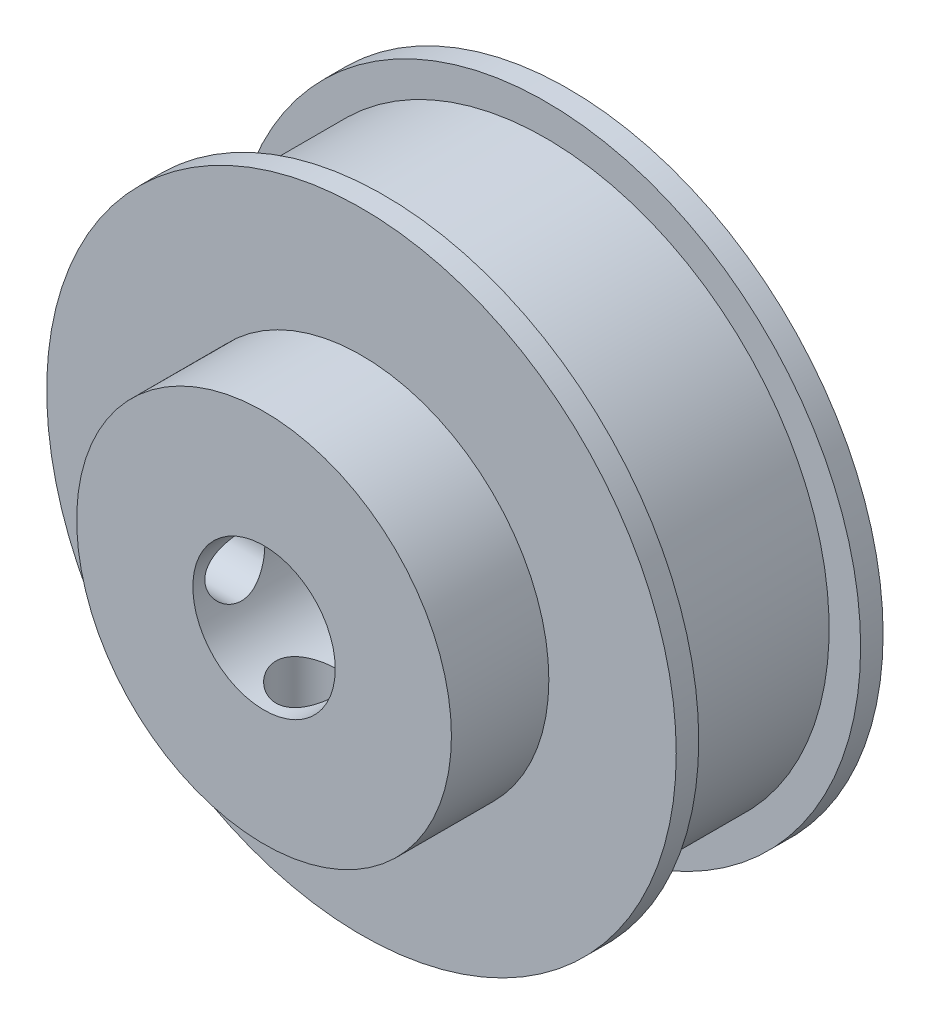
ISO-10303-21;
HEADER;
FILE_DESCRIPTION(('STEP AP214'),'2;1');
FILE_NAME('part.step','',(''),(''),'','','');
FILE_SCHEMA(('AUTOMOTIVE_DESIGN { 1 0 10303 214 1 1 1 1 }'));
ENDSEC;
DATA;
#1=APPLICATION_CONTEXT('core data for automotive mechanical design processes');
#2=APPLICATION_PROTOCOL_DEFINITION('international standard','automotive_design',2000,#1);
#3=PRODUCT_CONTEXT('',#1,'mechanical');
#4=PRODUCT('Part','Part','',(#3));
#5=PRODUCT_RELATED_PRODUCT_CATEGORY('part','',(#4));
#6=PRODUCT_DEFINITION_FORMATION('','',#4);
#7=PRODUCT_DEFINITION_CONTEXT('part definition',#1,'design');
#8=PRODUCT_DEFINITION('design','',#6,#7);
#9=PRODUCT_DEFINITION_SHAPE('','',#8);
#10=(LENGTH_UNIT() NAMED_UNIT(*) SI_UNIT(.MILLI.,.METRE.));
#11=(NAMED_UNIT(*) PLANE_ANGLE_UNIT() SI_UNIT($,.RADIAN.));
#12=(NAMED_UNIT(*) SI_UNIT($,.STERADIAN.) SOLID_ANGLE_UNIT());
#13=UNCERTAINTY_MEASURE_WITH_UNIT(LENGTH_MEASURE(1.E-05),#10,'distance_accuracy_value','');
#14=(GEOMETRIC_REPRESENTATION_CONTEXT(3) GLOBAL_UNCERTAINTY_ASSIGNED_CONTEXT((#13)) GLOBAL_UNIT_ASSIGNED_CONTEXT((#10,
#11,#12)) REPRESENTATION_CONTEXT('',''));
#15=CARTESIAN_POINT('',(0.,0.,0.));
#16=DIRECTION('',(0.,0.,1.));
#17=DIRECTION('',(1.,0.,0.));
#18=AXIS2_PLACEMENT_3D('',#15,#16,#17);
#19=CARTESIAN_POINT('',(0.,0.,13.8));
#20=DIRECTION('',(0.,0.,1.));
#21=DIRECTION('',(1.,0.,0.));
#22=AXIS2_PLACEMENT_3D('',#19,#20,#21);
#23=PLANE('',#22);
#24=CARTESIAN_POINT('',(0.,0.,13.8));
#25=DIRECTION('',(0.,0.,1.));
#26=DIRECTION('',(1.,0.,0.));
#27=AXIS2_PLACEMENT_3D('',#24,#25,#26);
#28=CIRCLE('',#27,21.);
#29=CARTESIAN_POINT('',(21.,0.,13.8));
#30=VERTEX_POINT('',#29);
#31=EDGE_CURVE('E144',#30,#30,#28,.T.);
#32=ORIENTED_EDGE('',*,*,#31,.T.);
#33=EDGE_LOOP('',(#32));
#34=FACE_BOUND('',#33,.T.);
#35=CARTESIAN_POINT('',(0.,0.,13.8));
#36=DIRECTION('',(0.,0.,1.));
#37=DIRECTION('',(1.,0.,0.));
#38=AXIS2_PLACEMENT_3D('',#35,#36,#37);
#39=CIRCLE('',#38,12.5);
#40=CARTESIAN_POINT('',(12.5,0.,13.8));
#41=VERTEX_POINT('',#40);
#42=EDGE_CURVE('E59',#41,#41,#39,.T.);
#43=ORIENTED_EDGE('',*,*,#42,.F.);
#44=EDGE_LOOP('',(#43));
#45=FACE_BOUND('',#44,.T.);
#46=ADVANCED_FACE('F31',(#34,#45),#23,.T.);
#47=CARTESIAN_POINT('',(0.,0.,1.5));
#48=DIRECTION('',(0.,0.,1.));
#49=DIRECTION('',(1.,0.,0.));
#50=AXIS2_PLACEMENT_3D('',#47,#48,#49);
#51=PLANE('',#50);
#52=CARTESIAN_POINT('',(0.,0.,1.5));
#53=DIRECTION('',(0.,0.,1.));
#54=DIRECTION('',(1.,0.,0.));
#55=AXIS2_PLACEMENT_3D('',#52,#53,#54);
#56=CIRCLE('',#55,21.);
#57=CARTESIAN_POINT('',(21.,0.,1.5));
#58=VERTEX_POINT('',#57);
#59=EDGE_CURVE('E10',#58,#58,#56,.T.);
#60=ORIENTED_EDGE('',*,*,#59,.T.);
#61=EDGE_LOOP('',(#60));
#62=FACE_BOUND('',#61,.T.);
#63=CARTESIAN_POINT('',(0.,0.,1.5));
#64=DIRECTION('',(0.,0.,1.));
#65=DIRECTION('',(1.,0.,0.));
#66=AXIS2_PLACEMENT_3D('',#63,#64,#65);
#67=CIRCLE('',#66,18.9);
#68=CARTESIAN_POINT('',(-18.9,0.,1.5));
#69=VERTEX_POINT('',#68);
#70=EDGE_CURVE('E51',#69,#69,#67,.T.);
#71=ORIENTED_EDGE('',*,*,#70,.F.);
#72=EDGE_LOOP('',(#71));
#73=FACE_BOUND('',#72,.T.);
#74=ADVANCED_FACE('F97',(#62,#73),#51,.T.);
#75=CARTESIAN_POINT('',(0.,0.,1.5));
#76=DIRECTION('',(0.,0.,-1.));
#77=DIRECTION('',(-1.,0.,0.));
#78=AXIS2_PLACEMENT_3D('',#75,#76,#77);
#79=CYLINDRICAL_SURFACE('',#78,21.);
#80=ORIENTED_EDGE('',*,*,#59,.F.);
#81=EDGE_LOOP('',(#80));
#82=FACE_BOUND('',#81,.T.);
#83=CARTESIAN_POINT('',(0.,0.,0.));
#84=DIRECTION('',(0.,0.,1.));
#85=DIRECTION('',(1.,0.,0.));
#86=AXIS2_PLACEMENT_3D('',#83,#84,#85);
#87=CIRCLE('',#86,21.);
#88=CARTESIAN_POINT('',(21.,0.,0.));
#89=VERTEX_POINT('',#88);
#90=EDGE_CURVE('E43',#89,#89,#87,.T.);
#91=ORIENTED_EDGE('',*,*,#90,.T.);
#92=EDGE_LOOP('',(#91));
#93=FACE_BOUND('',#92,.T.);
#94=ADVANCED_FACE('F33',(#82,#93),#79,.T.);
#95=CARTESIAN_POINT('',(0.,0.,0.));
#96=DIRECTION('',(0.,0.,1.));
#97=DIRECTION('',(1.,0.,0.));
#98=AXIS2_PLACEMENT_3D('',#95,#96,#97);
#99=PLANE('',#98);
#100=CARTESIAN_POINT('',(0.,0.,0.));
#101=DIRECTION('',(0.,0.,1.));
#102=DIRECTION('',(1.,0.,0.));
#103=AXIS2_PLACEMENT_3D('',#100,#101,#102);
#104=CIRCLE('',#103,4.75);
#105=CARTESIAN_POINT('',(4.75,0.,0.));
#106=VERTEX_POINT('',#105);
#107=EDGE_CURVE('E127',#106,#106,#104,.T.);
#108=ORIENTED_EDGE('',*,*,#107,.T.);
#109=EDGE_LOOP('',(#108));
#110=FACE_BOUND('',#109,.T.);
#111=ORIENTED_EDGE('',*,*,#90,.F.);
#112=EDGE_LOOP('',(#111));
#113=FACE_BOUND('',#112,.T.);
#114=ADVANCED_FACE('F116',(#110,#113),#99,.F.);
#115=CARTESIAN_POINT('',(0.,0.,12.3));
#116=DIRECTION('',(0.,0.,-1.));
#117=DIRECTION('',(-1.,0.,0.));
#118=AXIS2_PLACEMENT_3D('',#115,#116,#117);
#119=CYLINDRICAL_SURFACE('',#118,18.9);
#120=CARTESIAN_POINT('',(0.,0.,12.3));
#121=DIRECTION('',(0.,0.,1.));
#122=DIRECTION('',(1.,0.,0.));
#123=AXIS2_PLACEMENT_3D('',#120,#121,#122);
#124=CIRCLE('',#123,18.9);
#125=CARTESIAN_POINT('',(-18.9,0.,12.3));
#126=VERTEX_POINT('',#125);
#127=EDGE_CURVE('E48',#126,#126,#124,.T.);
#128=CARTESIAN_POINT('',(-18.9,0.,12.3));
#129=CARTESIAN_POINT('',(-18.9,0.,12.1875));
#130=CARTESIAN_POINT('',(-18.9,0.,12.075));
#131=CARTESIAN_POINT('',(-18.9,0.,11.85));
#132=CARTESIAN_POINT('',(-18.9,0.,11.7375));
#133=CARTESIAN_POINT('',(-18.9,0.,11.5125));
#134=CARTESIAN_POINT('',(-18.9,0.,11.4));
#135=CARTESIAN_POINT('',(-18.9,0.,11.175));
#136=CARTESIAN_POINT('',(-18.9,0.,11.0625));
#137=CARTESIAN_POINT('',(-18.9,0.,10.8375));
#138=CARTESIAN_POINT('',(-18.9,0.,10.725));
#139=CARTESIAN_POINT('',(-18.9,0.,10.5));
#140=CARTESIAN_POINT('',(-18.9,0.,10.3875));
#141=CARTESIAN_POINT('',(-18.9,0.,10.1625));
#142=CARTESIAN_POINT('',(-18.9,0.,10.05));
#143=CARTESIAN_POINT('',(-18.9,0.,9.825));
#144=CARTESIAN_POINT('',(-18.9,0.,9.7125));
#145=CARTESIAN_POINT('',(-18.9,0.,9.4875));
#146=CARTESIAN_POINT('',(-18.9,0.,9.375));
#147=CARTESIAN_POINT('',(-18.9,0.,9.15));
#148=CARTESIAN_POINT('',(-18.9,0.,9.0375));
#149=CARTESIAN_POINT('',(-18.9,0.,8.8125));
#150=CARTESIAN_POINT('',(-18.9,0.,8.7));
#151=CARTESIAN_POINT('',(-18.9,0.,8.475));
#152=CARTESIAN_POINT('',(-18.9,0.,8.3625));
#153=CARTESIAN_POINT('',(-18.9,0.,8.1375));
#154=CARTESIAN_POINT('',(-18.9,0.,8.025));
#155=CARTESIAN_POINT('',(-18.9,0.,7.8));
#156=CARTESIAN_POINT('',(-18.9,0.,7.6875));
#157=CARTESIAN_POINT('',(-18.9,0.,7.4625));
#158=CARTESIAN_POINT('',(-18.9,0.,7.35));
#159=CARTESIAN_POINT('',(-18.9,0.,7.125));
#160=CARTESIAN_POINT('',(-18.9,0.,7.0125));
#161=CARTESIAN_POINT('',(-18.9,0.,6.7875));
#162=CARTESIAN_POINT('',(-18.9,0.,6.675));
#163=CARTESIAN_POINT('',(-18.9,0.,6.45));
#164=CARTESIAN_POINT('',(-18.9,0.,6.3375));
#165=CARTESIAN_POINT('',(-18.9,0.,6.1125));
#166=CARTESIAN_POINT('',(-18.9,0.,6.));
#167=CARTESIAN_POINT('',(-18.9,0.,5.775));
#168=CARTESIAN_POINT('',(-18.9,0.,5.6625));
#169=CARTESIAN_POINT('',(-18.9,0.,5.4375));
#170=CARTESIAN_POINT('',(-18.9,0.,5.325));
#171=CARTESIAN_POINT('',(-18.9,0.,5.1));
#172=CARTESIAN_POINT('',(-18.9,0.,4.9875));
#173=CARTESIAN_POINT('',(-18.9,0.,4.7625));
#174=CARTESIAN_POINT('',(-18.9,0.,4.65));
#175=CARTESIAN_POINT('',(-18.9,0.,4.425));
#176=CARTESIAN_POINT('',(-18.9,0.,4.3125));
#177=CARTESIAN_POINT('',(-18.9,0.,4.0875));
#178=CARTESIAN_POINT('',(-18.9,0.,3.975));
#179=CARTESIAN_POINT('',(-18.9,0.,3.75));
#180=CARTESIAN_POINT('',(-18.9,0.,3.6375));
#181=CARTESIAN_POINT('',(-18.9,0.,3.4125));
#182=CARTESIAN_POINT('',(-18.9,0.,3.3));
#183=CARTESIAN_POINT('',(-18.9,0.,3.075));
#184=CARTESIAN_POINT('',(-18.9,0.,2.9625));
#185=CARTESIAN_POINT('',(-18.9,0.,2.7375));
#186=CARTESIAN_POINT('',(-18.9,0.,2.625));
#187=CARTESIAN_POINT('',(-18.9,0.,2.4));
#188=CARTESIAN_POINT('',(-18.9,0.,2.2875));
#189=CARTESIAN_POINT('',(-18.9,0.,2.0625));
#190=CARTESIAN_POINT('',(-18.9,0.,1.95));
#191=CARTESIAN_POINT('',(-18.9,0.,1.725));
#192=CARTESIAN_POINT('',(-18.9,0.,1.6125));
#193=CARTESIAN_POINT('',(-18.9,0.,1.5));
#194=B_SPLINE_CURVE_WITH_KNOTS('',3,(#128,#129,#130,#131,#132,#133,#134,#135,#136,#137,#138,
#139,#140,#141,#142,#143,#144,#145,#146,#147,#148,#149,#150,#151,#152,#153,#154,#155,#156,#157,
#158,#159,#160,#161,#162,#163,#164,#165,#166,#167,#168,#169,#170,#171,#172,#173,#174,#175,#176,
#177,#178,#179,#180,#181,#182,#183,#184,#185,#186,#187,#188,#189,#190,#191,#192,#193),
.UNSPECIFIED.,.F.,.F.,(4,2,2,2,2,2,2,2,2,2,2,2,2,2,2,2,2,2,2,2,2,2,2,2,2,2,2,2,2,2,2,2,4),(0.,
0.337500000000001,0.675,1.0125,1.35,1.6875,2.025,2.3625,2.7,3.0375,3.375,3.7125,4.05,4.3875,
4.725,5.0625,5.4,5.7375,6.075,6.4125,6.75,7.0875,7.425,7.7625,8.1,8.4375,8.775,9.1125,9.45,
9.7875,10.125,10.4625,10.8),.UNSPECIFIED.);
#195=EDGE_CURVE('BSEAM110',#126,#69,#194,.T.);
#196=ORIENTED_EDGE('',*,*,#127,.F.);
#197=ORIENTED_EDGE('',*,*,#70,.T.);
#198=ORIENTED_EDGE('',*,*,#195,.T.);
#199=ORIENTED_EDGE('',*,*,#195,.F.);
#200=EDGE_LOOP('',(#196,#198,#197,#199));
#201=FACE_BOUND('',#200,.T.);
#202=ADVANCED_FACE('F110',(#201),#119,.T.);
#203=CARTESIAN_POINT('',(0.,0.,12.3));
#204=DIRECTION('',(0.,0.,1.));
#205=DIRECTION('',(1.,0.,0.));
#206=AXIS2_PLACEMENT_3D('',#203,#204,#205);
#207=PLANE('',#206);
#208=CARTESIAN_POINT('',(0.,0.,12.3));
#209=DIRECTION('',(0.,0.,1.));
#210=DIRECTION('',(1.,0.,0.));
#211=AXIS2_PLACEMENT_3D('',#208,#209,#210);
#212=CIRCLE('',#211,21.);
#213=CARTESIAN_POINT('',(21.,0.,12.3));
#214=VERTEX_POINT('',#213);
#215=EDGE_CURVE('E142',#214,#214,#212,.T.);
#216=ORIENTED_EDGE('',*,*,#215,.F.);
#217=EDGE_LOOP('',(#216));
#218=FACE_BOUND('',#217,.T.);
#219=ORIENTED_EDGE('',*,*,#127,.T.);
#220=EDGE_LOOP('',(#219));
#221=FACE_BOUND('',#220,.T.);
#222=ADVANCED_FACE('F106',(#218,#221),#207,.F.);
#223=CARTESIAN_POINT('',(0.,0.,13.8));
#224=DIRECTION('',(0.,0.,-1.));
#225=DIRECTION('',(-1.,0.,0.));
#226=AXIS2_PLACEMENT_3D('',#223,#224,#225);
#227=CYLINDRICAL_SURFACE('',#226,21.);
#228=ORIENTED_EDGE('',*,*,#31,.F.);
#229=EDGE_LOOP('',(#228));
#230=FACE_BOUND('',#229,.T.);
#231=ORIENTED_EDGE('',*,*,#215,.T.);
#232=EDGE_LOOP('',(#231));
#233=FACE_BOUND('',#232,.T.);
#234=ADVANCED_FACE('F109',(#230,#233),#227,.T.);
#235=CARTESIAN_POINT('',(0.,0.,20.3));
#236=DIRECTION('',(0.,0.,-1.));
#237=DIRECTION('',(-1.,0.,0.));
#238=AXIS2_PLACEMENT_3D('',#235,#236,#237);
#239=CYLINDRICAL_SURFACE('',#238,12.5);
#240=CARTESIAN_POINT('',(-12.5,0.,19.5));
#241=CARTESIAN_POINT('',(-12.4999981342099,-0.111577020127934,19.4999954713698));
#242=CARTESIAN_POINT('',(-12.4984904676373,-0.223216523860334,19.4906313927068));
#243=CARTESIAN_POINT('',(-12.4926212341856,-0.443368779658238,19.453435552302));
#244=CARTESIAN_POINT('',(-12.4882569793104,-0.551878486135173,19.4255863960999));
#245=CARTESIAN_POINT('',(-12.4771644640129,-0.762553771126289,19.352279119554));
#246=CARTESIAN_POINT('',(-12.4704380773984,-0.864724302944008,19.3068349538792));
#247=CARTESIAN_POINT('',(-12.4553623980115,-1.05997584434547,19.1996632056022));
#248=CARTESIAN_POINT('',(-12.4470133072085,-1.15305798294893,19.1379376491164));
#249=CARTESIAN_POINT('',(-12.4295364290338,-1.32832749604674,18.9993743957376));
#250=CARTESIAN_POINT('',(-12.4204030044304,-1.41042286652597,18.9224210210548));
#251=CARTESIAN_POINT('',(-12.4024303990938,-1.56059410283783,18.755835532725));
#252=CARTESIAN_POINT('',(-12.393591236265,-1.62866911690709,18.6662026493313));
#253=CARTESIAN_POINT('',(-12.377153335782,-1.74923165413214,18.4761761138479));
#254=CARTESIAN_POINT('',(-12.369561883485,-1.80162899846097,18.3757245626384));
#255=CARTESIAN_POINT('',(-12.3565566594955,-1.88877230962607,18.1673043371312));
#256=CARTESIAN_POINT('',(-12.3511427525034,-1.92351937318009,18.0593361303625));
#257=CARTESIAN_POINT('',(-12.3431614474236,-1.97408758681328,17.8399196231352));
#258=CARTESIAN_POINT('',(-12.3405702530036,-1.990067044504,17.72850868905));
#259=CARTESIAN_POINT('',(-12.3384556715911,-2.00313711337577,17.5045590129146));
#260=CARTESIAN_POINT('',(-12.3389320844424,-2.00022895694193,17.3920203449255));
#261=CARTESIAN_POINT('',(-12.3428771480604,-1.97573547058135,17.1701349695011));
#262=CARTESIAN_POINT('',(-12.3463174079177,-1.95432734726415,17.060768122639));
#263=CARTESIAN_POINT('',(-12.3557581320174,-1.89371943513841,16.847198928902));
#264=CARTESIAN_POINT('',(-12.36175867776,-1.85451907995672,16.7429967465491));
#265=CARTESIAN_POINT('',(-12.375674818266,-1.75925788747207,16.5421807321441));
#266=CARTESIAN_POINT('',(-12.3835988093069,-1.7031228581751,16.4456027003146));
#267=CARTESIAN_POINT('',(-12.4004630811492,-1.57563852632363,16.2631697283147));
#268=CARTESIAN_POINT('',(-12.4094034376511,-1.50428809015537,16.1773155878768));
#269=CARTESIAN_POINT('',(-12.4274181245254,-1.34742984087892,16.0177411995627));
#270=CARTESIAN_POINT('',(-12.4364928200271,-1.26176985545599,15.9441704929312));
#271=CARTESIAN_POINT('',(-12.4536592708467,-1.07924037468053,15.812425261157));
#272=CARTESIAN_POINT('',(-12.4617510207175,-0.982370817216383,15.7542508213299));
#273=CARTESIAN_POINT('',(-12.4760500569944,-0.780035888309123,15.654938321886));
#274=CARTESIAN_POINT('',(-12.4822559575706,-0.674564267421534,15.6138127827311));
#275=CARTESIAN_POINT('',(-12.492072755936,-0.458089833939773,15.549900642074));
#276=CARTESIAN_POINT('',(-12.4956838535962,-0.347087448070732,15.5271126280629));
#277=CARTESIAN_POINT('',(-12.4998774645506,-0.123992055401972,15.500723529987));
#278=CARTESIAN_POINT('',(-12.5004923996757,-0.0119239336604407,15.4969170340423));
#279=CARTESIAN_POINT('',(-12.4987129750933,0.21124937151114,15.5080523816093));
#280=CARTESIAN_POINT('',(-12.4963187218055,0.322354588854285,15.5229935621113));
#281=CARTESIAN_POINT('',(-12.4888100015234,0.539818798235505,15.5710292981892));
#282=CARTESIAN_POINT('',(-12.4837106780256,0.646200674402081,15.6040228253046));
#283=CARTESIAN_POINT('',(-12.4713614614776,0.851922990585993,15.6871194685301));
#284=CARTESIAN_POINT('',(-12.4641114556453,0.95126306099119,15.7372234819381));
#285=CARTESIAN_POINT('',(-12.4481852151843,1.14097865112887,15.8535939993033));
#286=CARTESIAN_POINT('',(-12.4394977755831,1.2312740030957,15.9199896360231));
#287=CARTESIAN_POINT('',(-12.4216959541371,1.39951415639528,16.0668801543625));
#288=CARTESIAN_POINT('',(-12.4125815438834,1.47745813440283,16.1473759751283));
#289=CARTESIAN_POINT('',(-12.3948490273074,1.6195386653,16.321100388104));
#290=CARTESIAN_POINT('',(-12.3862364645378,1.6835368741472,16.4144427787868));
#291=CARTESIAN_POINT('',(-12.3705841030174,1.79494489210119,16.6106737811203));
#292=CARTESIAN_POINT('',(-12.3635442573346,1.84235519623835,16.7135621077771));
#293=CARTESIAN_POINT('',(-12.3518754120478,1.91903158354154,16.9255669592182));
#294=CARTESIAN_POINT('',(-12.3472370587722,1.94836814902516,17.0346574545979));
#295=CARTESIAN_POINT('',(-12.3408723222072,1.98828718554459,17.256297569992));
#296=CARTESIAN_POINT('',(-12.3391457074239,1.99887114748454,17.3688469142908));
#297=CARTESIAN_POINT('',(-12.3388093758569,2.00094546618394,17.5928294934366));
#298=CARTESIAN_POINT('',(-12.3401641282165,1.99265347821446,17.7042607195398));
#299=CARTESIAN_POINT('',(-12.3457602825821,1.95768017972975,17.9241213226272));
#300=CARTESIAN_POINT('',(-12.3500016772787,1.93099891577862,18.0325507072119));
#301=CARTESIAN_POINT('',(-12.3608801586201,1.86008521855063,18.2432553500165));
#302=CARTESIAN_POINT('',(-12.3675148843103,1.81587007770133,18.3455365576413));
#303=CARTESIAN_POINT('',(-12.3824349767408,1.71116577284244,18.5412644676731));
#304=CARTESIAN_POINT('',(-12.3907204147391,1.65067590624507,18.6347107884382));
#305=CARTESIAN_POINT('',(-12.4081216807701,1.51435663599677,18.8112185808365));
#306=CARTESIAN_POINT('',(-12.417245602178,1.43836664580959,18.8941552479004));
#307=CARTESIAN_POINT('',(-12.4352300129975,1.27354334357952,19.0461753813975));
#308=CARTESIAN_POINT('',(-12.44409044097,1.18470706402004,19.1152556381487));
#309=CARTESIAN_POINT('',(-12.4606140562915,0.99604834657733,19.2379974661718));
#310=CARTESIAN_POINT('',(-12.4682693265296,0.896160049794844,19.2915588738874));
#311=CARTESIAN_POINT('',(-12.4814428750468,0.688725166968653,19.3810612928991));
#312=CARTESIAN_POINT('',(-12.4869633156233,0.581186461209752,19.417020143104));
#313=CARTESIAN_POINT('',(-12.4940175589639,0.394335518838039,19.4623457387355));
#314=CARTESIAN_POINT('',(-12.4962491778317,0.316163477498691,19.4764439027928));
#315=CARTESIAN_POINT('',(-12.4992410506714,0.158671480151703,19.4952725728636));
#316=CARTESIAN_POINT('',(-12.5000013269159,0.0793515415388271,19.5000032206792));
#317=CARTESIAN_POINT('',(-12.5,0.,19.5));
#318=B_SPLINE_CURVE_WITH_KNOTS('',3,(#240,#241,#242,#243,#244,#245,#246,#247,#248,#249,#250,
#251,#252,#253,#254,#255,#256,#257,#258,#259,#260,#261,#262,#263,#264,#265,#266,#267,#268,#269,
#270,#271,#272,#273,#274,#275,#276,#277,#278,#279,#280,#281,#282,#283,#284,#285,#286,#287,#288,
#289,#290,#291,#292,#293,#294,#295,#296,#297,#298,#299,#300,#301,#302,#303,#304,#305,#306,#307,
#308,#309,#310,#311,#312,#313,#314,#315,#316,#317),.UNSPECIFIED.,.T.,.F.,(4,2,2,2,2,2,2,2,2,2,2,
2,2,2,2,2,2,2,2,2,2,2,2,2,2,2,2,2,2,2,2,2,2,2,2,2,2,2,4),(0.,0.334441046622945,
0.669197249319467,1.00368849765686,1.33813814029104,1.67523334608234,2.0123490250128,
2.35136809625946,2.69036609964137,3.0264835846965,3.36257913887026,3.695490558905,
4.02841257712192,4.36281487068318,4.69724208737484,5.03548313337389,5.37372605363721,
5.71221693636019,6.05068174320194,6.38547572150114,6.72025786018134,7.05318530227048,
7.38613020622256,7.72180459283845,8.0575013456327,8.39639027086604,8.73526908182521,
9.07281785760314,9.41033979575026,9.74398956846141,10.0776384963298,10.4109591848676,
10.7442942653298,11.0812763085405,11.4183363199473,11.7575256865024,12.0963705940352,
12.3342225666998,12.5720709388195),.UNSPECIFIED.);
#319=CARTESIAN_POINT('',(-12.5,0.,19.5));
#320=VERTEX_POINT('',#319);
#321=EDGE_CURVE('E60',#320,#320,#318,.T.);
#322=ORIENTED_EDGE('',*,*,#321,.T.);
#323=EDGE_LOOP('',(#322));
#324=FACE_BOUND('',#323,.T.);
#325=CARTESIAN_POINT('',(0.,-12.5,19.5));
#326=CARTESIAN_POINT('',(0.111577020127936,-12.4999981342099,19.4999954713698));
#327=CARTESIAN_POINT('',(0.223216523860337,-12.4984904676373,19.4906313927068));
#328=CARTESIAN_POINT('',(0.443368779658241,-12.4926212341856,19.453435552302));
#329=CARTESIAN_POINT('',(0.551878486135176,-12.4882569793104,19.4255863960999));
#330=CARTESIAN_POINT('',(0.762553771126291,-12.4771644640129,19.352279119554));
#331=CARTESIAN_POINT('',(0.86472430294401,-12.4704380773984,19.3068349538792));
#332=CARTESIAN_POINT('',(1.05997584434547,-12.4553623980115,19.1996632056022));
#333=CARTESIAN_POINT('',(1.15305798294894,-12.4470133072085,19.1379376491164));
#334=CARTESIAN_POINT('',(1.32832749604675,-12.4295364290338,18.9993743957376));
#335=CARTESIAN_POINT('',(1.41042286652597,-12.4204030044304,18.9224210210548));
#336=CARTESIAN_POINT('',(1.56059410283783,-12.4024303990938,18.755835532725));
#337=CARTESIAN_POINT('',(1.62866911690709,-12.393591236265,18.6662026493313));
#338=CARTESIAN_POINT('',(1.74923165413214,-12.377153335782,18.4761761138479));
#339=CARTESIAN_POINT('',(1.80162899846097,-12.369561883485,18.3757245626384));
#340=CARTESIAN_POINT('',(1.88877230962607,-12.3565566594955,18.1673043371312));
#341=CARTESIAN_POINT('',(1.92351937318009,-12.3511427525034,18.0593361303625));
#342=CARTESIAN_POINT('',(1.97408758681328,-12.3431614474236,17.8399196231352));
#343=CARTESIAN_POINT('',(1.99006704450401,-12.3405702530036,17.72850868905));
#344=CARTESIAN_POINT('',(2.00313711337577,-12.3384556715911,17.5045590129146));
#345=CARTESIAN_POINT('',(2.00022895694193,-12.3389320844424,17.3920203449255));
#346=CARTESIAN_POINT('',(1.97573547058135,-12.3428771480604,17.1701349695011));
#347=CARTESIAN_POINT('',(1.95432734726415,-12.3463174079177,17.060768122639));
#348=CARTESIAN_POINT('',(1.89371943513841,-12.3557581320174,16.847198928902));
#349=CARTESIAN_POINT('',(1.85451907995672,-12.36175867776,16.7429967465491));
#350=CARTESIAN_POINT('',(1.75925788747207,-12.375674818266,16.5421807321441));
#351=CARTESIAN_POINT('',(1.7031228581751,-12.3835988093069,16.4456027003146));
#352=CARTESIAN_POINT('',(1.57563852632363,-12.4004630811492,16.2631697283147));
#353=CARTESIAN_POINT('',(1.50428809015537,-12.4094034376511,16.1773155878768));
#354=CARTESIAN_POINT('',(1.34742984087892,-12.4274181245254,16.0177411995627));
#355=CARTESIAN_POINT('',(1.26176985545599,-12.4364928200271,15.9441704929312));
#356=CARTESIAN_POINT('',(1.07924037468053,-12.4536592708467,15.812425261157));
#357=CARTESIAN_POINT('',(0.982370817216381,-12.4617510207175,15.7542508213299));
#358=CARTESIAN_POINT('',(0.78003588830912,-12.4760500569944,15.654938321886));
#359=CARTESIAN_POINT('',(0.674564267421531,-12.4822559575706,15.6138127827311));
#360=CARTESIAN_POINT('',(0.45808983393977,-12.492072755936,15.549900642074));
#361=CARTESIAN_POINT('',(0.34708744807073,-12.4956838535962,15.5271126280629));
#362=CARTESIAN_POINT('',(0.123992055401969,-12.4998774645506,15.500723529987));
#363=CARTESIAN_POINT('',(0.0119239336604373,-12.5004923996757,15.4969170340423));
#364=CARTESIAN_POINT('',(-0.211249371511144,-12.4987129750933,15.5080523816093));
#365=CARTESIAN_POINT('',(-0.322354588854289,-12.4963187218055,15.5229935621113));
#366=CARTESIAN_POINT('',(-0.539818798235508,-12.4888100015234,15.5710292981892));
#367=CARTESIAN_POINT('',(-0.646200674402082,-12.4837106780256,15.6040228253046));
#368=CARTESIAN_POINT('',(-0.851922990585995,-12.4713614614776,15.6871194685301));
#369=CARTESIAN_POINT('',(-0.951263060991192,-12.4641114556453,15.7372234819381));
#370=CARTESIAN_POINT('',(-1.14097865112887,-12.4481852151843,15.8535939993033));
#371=CARTESIAN_POINT('',(-1.2312740030957,-12.4394977755831,15.9199896360231));
#372=CARTESIAN_POINT('',(-1.39951415639529,-12.4216959541371,16.0668801543625));
#373=CARTESIAN_POINT('',(-1.47745813440283,-12.4125815438834,16.1473759751283));
#374=CARTESIAN_POINT('',(-1.61953866530001,-12.3948490273074,16.321100388104));
#375=CARTESIAN_POINT('',(-1.6835368741472,-12.3862364645378,16.4144427787868));
#376=CARTESIAN_POINT('',(-1.7949448921012,-12.3705841030174,16.6106737811203));
#377=CARTESIAN_POINT('',(-1.84235519623835,-12.3635442573346,16.7135621077771));
#378=CARTESIAN_POINT('',(-1.91903158354154,-12.3518754120478,16.9255669592182));
#379=CARTESIAN_POINT('',(-1.94836814902516,-12.3472370587722,17.0346574545979));
#380=CARTESIAN_POINT('',(-1.98828718554459,-12.3408723222072,17.256297569992));
#381=CARTESIAN_POINT('',(-1.99887114748454,-12.3391457074239,17.3688469142908));
#382=CARTESIAN_POINT('',(-2.00094546618394,-12.3388093758569,17.5928294934366));
#383=CARTESIAN_POINT('',(-1.99265347821446,-12.3401641282165,17.7042607195398));
#384=CARTESIAN_POINT('',(-1.95768017972975,-12.3457602825821,17.9241213226272));
#385=CARTESIAN_POINT('',(-1.93099891577862,-12.3500016772787,18.0325507072119));
#386=CARTESIAN_POINT('',(-1.86008521855063,-12.3608801586201,18.2432553500165));
#387=CARTESIAN_POINT('',(-1.81587007770133,-12.3675148843103,18.3455365576413));
#388=CARTESIAN_POINT('',(-1.71116577284243,-12.3824349767408,18.5412644676731));
#389=CARTESIAN_POINT('',(-1.65067590624507,-12.3907204147391,18.6347107884382));
#390=CARTESIAN_POINT('',(-1.51435663599676,-12.4081216807701,18.8112185808365));
#391=CARTESIAN_POINT('',(-1.43836664580959,-12.417245602178,18.8941552479004));
#392=CARTESIAN_POINT('',(-1.27354334357952,-12.4352300129975,19.0461753813975));
#393=CARTESIAN_POINT('',(-1.18470706402004,-12.44409044097,19.1152556381487));
#394=CARTESIAN_POINT('',(-0.996048346577327,-12.4606140562915,19.2379974661718));
#395=CARTESIAN_POINT('',(-0.896160049794841,-12.4682693265296,19.2915588738874));
#396=CARTESIAN_POINT('',(-0.68872516696865,-12.4814428750468,19.3810612928991));
#397=CARTESIAN_POINT('',(-0.581186461209748,-12.4869633156233,19.417020143104));
#398=CARTESIAN_POINT('',(-0.394335518838035,-12.4940175589639,19.4623457387355));
#399=CARTESIAN_POINT('',(-0.316163477498688,-12.4962491778317,19.4764439027928));
#400=CARTESIAN_POINT('',(-0.158671480151701,-12.4992410506714,19.4952725728636));
#401=CARTESIAN_POINT('',(-0.079351541538825,-12.5000013269159,19.5000032206792));
#402=CARTESIAN_POINT('',(0.,-12.5,19.5));
#403=B_SPLINE_CURVE_WITH_KNOTS('',3,(#325,#326,#327,#328,#329,#330,#331,#332,#333,#334,#335,
#336,#337,#338,#339,#340,#341,#342,#343,#344,#345,#346,#347,#348,#349,#350,#351,#352,#353,#354,
#355,#356,#357,#358,#359,#360,#361,#362,#363,#364,#365,#366,#367,#368,#369,#370,#371,#372,#373,
#374,#375,#376,#377,#378,#379,#380,#381,#382,#383,#384,#385,#386,#387,#388,#389,#390,#391,#392,
#393,#394,#395,#396,#397,#398,#399,#400,#401,#402),.UNSPECIFIED.,.T.,.F.,(4,2,2,2,2,2,2,2,2,2,2,
2,2,2,2,2,2,2,2,2,2,2,2,2,2,2,2,2,2,2,2,2,2,2,2,2,2,2,4),(0.,0.334441046622945,
0.669197249319468,1.00368849765686,1.33813814029104,1.67523334608234,2.0123490250128,
2.35136809625945,2.69036609964138,3.0264835846965,3.36257913887026,3.695490558905,
4.02841257712193,4.36281487068318,4.69724208737484,5.0354831333739,5.37372605363722,
5.71221693636019,6.05068174320195,6.38547572150115,6.72025786018135,7.05318530227048,
7.38613020622257,7.72180459283845,8.05750134563271,8.39639027086604,8.73526908182521,
9.07281785760315,9.41033979575028,9.74398956846142,10.0776384963298,10.4109591848676,
10.7442942653299,11.0812763085405,11.4183363199474,11.7575256865024,12.0963705940352,
12.3342225666999,12.5720709388195),.UNSPECIFIED.);
#404=CARTESIAN_POINT('',(0.,-12.5,19.5));
#405=VERTEX_POINT('',#404);
#406=EDGE_CURVE('E53',#405,#405,#403,.T.);
#407=ORIENTED_EDGE('',*,*,#406,.T.);
#408=EDGE_LOOP('',(#407));
#409=FACE_BOUND('',#408,.T.);
#410=CARTESIAN_POINT('',(0.,0.,20.3));
#411=DIRECTION('',(0.,0.,1.));
#412=DIRECTION('',(1.,0.,0.));
#413=AXIS2_PLACEMENT_3D('',#410,#411,#412);
#414=CIRCLE('',#413,12.5);
#415=CARTESIAN_POINT('',(12.5,0.,20.3));
#416=VERTEX_POINT('',#415);
#417=EDGE_CURVE('E140',#416,#416,#414,.T.);
#418=ORIENTED_EDGE('',*,*,#417,.F.);
#419=EDGE_LOOP('',(#418));
#420=FACE_BOUND('',#419,.T.);
#421=ORIENTED_EDGE('',*,*,#42,.T.);
#422=EDGE_LOOP('',(#421));
#423=FACE_BOUND('',#422,.T.);
#424=ADVANCED_FACE('F61',(#324,#409,#420,#423),#239,.T.);
#425=CARTESIAN_POINT('',(0.,0.,20.3));
#426=DIRECTION('',(0.,0.,1.));
#427=DIRECTION('',(1.,0.,0.));
#428=AXIS2_PLACEMENT_3D('',#425,#426,#427);
#429=PLANE('',#428);
#430=CARTESIAN_POINT('',(0.,0.,20.3));
#431=DIRECTION('',(0.,0.,1.));
#432=DIRECTION('',(1.,0.,0.));
#433=AXIS2_PLACEMENT_3D('',#430,#431,#432);
#434=CIRCLE('',#433,4.75);
#435=CARTESIAN_POINT('',(4.75,0.,20.3));
#436=VERTEX_POINT('',#435);
#437=EDGE_CURVE('E80',#436,#436,#434,.T.);
#438=ORIENTED_EDGE('',*,*,#437,.F.);
#439=EDGE_LOOP('',(#438));
#440=FACE_BOUND('',#439,.T.);
#441=ORIENTED_EDGE('',*,*,#417,.T.);
#442=EDGE_LOOP('',(#441));
#443=FACE_BOUND('',#442,.T.);
#444=ADVANCED_FACE('F69',(#440,#443),#429,.T.);
#445=CARTESIAN_POINT('',(0.,-21.,17.5));
#446=DIRECTION('',(0.,1.,0.));
#447=DIRECTION('',(0.,0.,1.));
#448=AXIS2_PLACEMENT_3D('',#445,#446,#447);
#449=CYLINDRICAL_SURFACE('',#448,2.);
#450=CARTESIAN_POINT('',(0.,-4.75,19.5));
#451=CARTESIAN_POINT('',(0.10703646236846,-4.74999105230107,19.49998814533));
#452=CARTESIAN_POINT('',(0.214236246167392,-4.7463402994097,19.4913565895315));
#453=CARTESIAN_POINT('',(0.425593131869903,-4.73208882609393,19.4571391510735));
#454=CARTESIAN_POINT('',(0.529741661649222,-4.7214701827862,19.4315095440171));
#455=CARTESIAN_POINT('',(0.731590406184855,-4.69442284735135,19.3644147945537));
#456=CARTESIAN_POINT('',(0.829311330167876,-4.67801402078023,19.3230037583225));
#457=CARTESIAN_POINT('',(1.01632284675021,-4.64097919078582,19.2257473571231));
#458=CARTESIAN_POINT('',(1.10561588355067,-4.62035441557184,19.1699061947558));
#459=CARTESIAN_POINT('',(1.27793883653739,-4.57576887526126,19.0423656992795));
#460=CARTESIAN_POINT('',(1.36048223127562,-4.55169736788395,18.9700480867997));
#461=CARTESIAN_POINT('',(1.51268912853783,-4.50340541179333,18.81291550367));
#462=CARTESIAN_POINT('',(1.58234571599153,-4.4791848902796,18.7280938669603));
#463=CARTESIAN_POINT('',(1.71027969557346,-4.43196710928289,18.543171836268));
#464=CARTESIAN_POINT('',(1.76780496391063,-4.40909335958272,18.4425162424037));
#465=CARTESIAN_POINT('',(1.86489069620242,-4.36892020968374,18.2318559560335));
#466=CARTESIAN_POINT('',(1.90446060785823,-4.35161787932547,18.1218562164644));
#467=CARTESIAN_POINT('',(1.96249248078311,-4.32574780180008,17.9012307350763));
#468=CARTESIAN_POINT('',(1.98189190257055,-4.31679434717452,17.7908985723402));
#469=CARTESIAN_POINT('',(2.00195562895775,-4.30752932662971,17.5682098561765));
#470=CARTESIAN_POINT('',(2.00263058226539,-4.30721284881606,17.4558544897403));
#471=CARTESIAN_POINT('',(1.98593120072108,-4.31493181644961,17.2417391267059));
#472=CARTESIAN_POINT('',(1.96997131078922,-4.32231278335098,17.1398404376461));
#473=CARTESIAN_POINT('',(1.92283162811083,-4.34348696653289,16.9403306214134));
#474=CARTESIAN_POINT('',(1.89164884741754,-4.35728144163054,16.8427203400698));
#475=CARTESIAN_POINT('',(1.81433790634179,-4.39004171904363,16.652066315206));
#476=CARTESIAN_POINT('',(1.76790298398402,-4.40911227810592,16.5591657763444));
#477=CARTESIAN_POINT('',(1.66162325591989,-4.45025281005121,16.3821089440219));
#478=CARTESIAN_POINT('',(1.60177309979156,-4.47232397828682,16.2979561590997));
#479=CARTESIAN_POINT('',(1.46428805277278,-4.51930009875198,16.1331243123109));
#480=CARTESIAN_POINT('',(1.38556278942612,-4.54428505688557,16.0533749108059));
#481=CARTESIAN_POINT('',(1.21561328405726,-4.59266646060081,15.9078945918117));
#482=CARTESIAN_POINT('',(1.12438599890452,-4.61606251734623,15.8421670973995));
#483=CARTESIAN_POINT('',(0.929145948219356,-4.65933566537717,15.7251934799301));
#484=CARTESIAN_POINT('',(0.824878687890048,-4.67911472030857,15.6743331679441));
#485=CARTESIAN_POINT('',(0.608222262411324,-4.7121696275971,15.5912027892268));
#486=CARTESIAN_POINT('',(0.495837723966101,-4.72544915152312,15.5589222250242));
#487=CARTESIAN_POINT('',(0.273899430083203,-4.7433183819797,15.5158312001314));
#488=CARTESIAN_POINT('',(0.16462836290715,-4.74841197266554,15.5037735937097));
#489=CARTESIAN_POINT('',(-0.0544859422097742,-4.7509495140171,15.4977431122997));
#490=CARTESIAN_POINT('',(-0.164329001896025,-4.74839572034202,15.5037649046447));
#491=CARTESIAN_POINT('',(-0.375578198064439,-4.73625128095379,15.5328362848694));
#492=CARTESIAN_POINT('',(-0.477129162603384,-4.72702550402368,15.5550033713998));
#493=CARTESIAN_POINT('',(-0.674955484098691,-4.70285789767311,15.6145004508135));
#494=CARTESIAN_POINT('',(-0.771230176352191,-4.68791534993975,15.6518323491937));
#495=CARTESIAN_POINT('',(-0.959158229909813,-4.65316408364171,15.7418168089221));
#496=CARTESIAN_POINT('',(-1.05057430517146,-4.633218314788,15.7949102797936));
#497=CARTESIAN_POINT('',(-1.22352777344185,-4.59058023824968,15.9144272117933));
#498=CARTESIAN_POINT('',(-1.30506098197807,-4.56788677524527,15.9808562879069));
#499=CARTESIAN_POINT('',(-1.46218525430955,-4.52014832220439,16.1308213150576));
#500=CARTESIAN_POINT('',(-1.53690971771378,-4.49505251450344,16.2152513746851));
#501=CARTESIAN_POINT('',(-1.67137911518237,-4.44680874465642,16.3958403462587));
#502=CARTESIAN_POINT('',(-1.73112037565901,-4.42366126112372,16.4920021260189));
#503=CARTESIAN_POINT('',(-1.83465029067007,-4.38175075287145,16.6954630808948));
#504=CARTESIAN_POINT('',(-1.87817619877721,-4.3630615717636,16.8029122991087));
#505=CARTESIAN_POINT('',(-1.94613970779112,-4.33317944385815,17.0246509697204));
#506=CARTESIAN_POINT('',(-1.97059349891389,-4.32198014009814,17.138934531542));
#507=CARTESIAN_POINT('',(-1.99809365532077,-4.30933055153168,17.3614609279863));
#508=CARTESIAN_POINT('',(-2.00266563478006,-4.30718588214918,17.4694765391154));
#509=CARTESIAN_POINT('',(-1.99436289136938,-4.31103684419066,17.6846758624691));
#510=CARTESIAN_POINT('',(-1.98149098638983,-4.31703116084065,17.7918597062449));
#511=CARTESIAN_POINT('',(-1.93995635081153,-4.33584430782861,17.9969853911048));
#512=CARTESIAN_POINT('',(-1.91209039204409,-4.34831777145251,18.095123302676));
#513=CARTESIAN_POINT('',(-1.84214689268935,-4.37840569203651,18.2853485056974));
#514=CARTESIAN_POINT('',(-1.80006534139776,-4.39602159966499,18.3774340808083));
#515=CARTESIAN_POINT('',(-1.69994007024285,-4.43573763071445,18.5590575441296));
#516=CARTESIAN_POINT('',(-1.64108110570075,-4.45804534068644,18.6480997388539));
#517=CARTESIAN_POINT('',(-1.51020038304186,-4.5040651794814,18.81552056148));
#518=CARTESIAN_POINT('',(-1.43817390715273,-4.52777780960673,18.8938953497547));
#519=CARTESIAN_POINT('',(-1.27659022248803,-4.57607254723289,19.0438109838857));
#520=CARTESIAN_POINT('',(-1.1861231154911,-4.60058638517,19.1143977562201));
#521=CARTESIAN_POINT('',(-0.993725379452196,-4.64594055900097,19.23944489544));
#522=CARTESIAN_POINT('',(-0.891789570387901,-4.66677922394583,19.2938979345963));
#523=CARTESIAN_POINT('',(-0.680840837781724,-4.70215008458216,19.3839868860328));
#524=CARTESIAN_POINT('',(-0.571965756964757,-4.71677703656465,19.4199074725507));
#525=CARTESIAN_POINT('',(-0.349166725075991,-4.73846042696525,19.4725872752913));
#526=CARTESIAN_POINT('',(-0.235259686811356,-4.74554047417121,19.4894062574434));
#527=CARTESIAN_POINT('',(-0.0806138559737793,-4.74949001252044,19.4987858990016));
#528=CARTESIAN_POINT('',(-0.0403185146594526,-4.75000337042091,19.5000044654193));
#529=CARTESIAN_POINT('',(0.,-4.75,19.5));
#530=B_SPLINE_CURVE_WITH_KNOTS('',3,(#450,#451,#452,#453,#454,#455,#456,#457,#458,#459,#460,
#461,#462,#463,#464,#465,#466,#467,#468,#469,#470,#471,#472,#473,#474,#475,#476,#477,#478,#479,
#480,#481,#482,#483,#484,#485,#486,#487,#488,#489,#490,#491,#492,#493,#494,#495,#496,#497,#498,
#499,#500,#501,#502,#503,#504,#505,#506,#507,#508,#509,#510,#511,#512,#513,#514,#515,#516,#517,
#518,#519,#520,#521,#522,#523,#524,#525,#526,#527,#528,#529),.UNSPECIFIED.,.T.,.F.,(4,2,2,2,2,2,
2,2,2,2,2,2,2,2,2,2,2,2,2,2,2,2,2,2,2,2,2,2,2,2,2,2,2,2,2,2,2,2,2,4),(0.,0.320992833427257,
0.642814581763423,0.963542757751976,1.2841776305755,1.61977067727506,1.95554328441993,
2.30826935782324,2.66080961894182,2.99611267136669,3.33122503119564,3.63999866694789,
3.94883293312584,4.26430374352242,4.57990059829875,4.92278837411685,5.26575976135261,
5.61697022291763,5.96798205692135,6.29642217319481,6.62476542288597,6.93639255342286,
7.24805885281148,7.56943103565565,7.89093881783371,8.23588662956777,8.58091893324744,
8.93132109614982,9.28142547982678,9.60412990992076,9.92678221645597,10.2337737894146,
10.5408520476219,10.8666093059307,11.1924835089913,11.5428100141678,11.8932953899747,
12.2382234684013,12.5820693217041,12.7029809622212),.UNSPECIFIED.);
#531=CARTESIAN_POINT('',(0.,-4.75,19.5));
#532=VERTEX_POINT('',#531);
#533=EDGE_CURVE('E74',#532,#532,#530,.T.);
#534=ORIENTED_EDGE('',*,*,#533,.T.);
#535=EDGE_LOOP('',(#534));
#536=FACE_BOUND('',#535,.T.);
#537=ORIENTED_EDGE('',*,*,#406,.F.);
#538=EDGE_LOOP('',(#537));
#539=FACE_BOUND('',#538,.T.);
#540=ADVANCED_FACE('F65',(#536,#539),#449,.F.);
#541=CARTESIAN_POINT('',(-21.,0.,17.5));
#542=DIRECTION('',(1.,0.,0.));
#543=DIRECTION('',(0.,0.,-1.));
#544=AXIS2_PLACEMENT_3D('',#541,#542,#543);
#545=CYLINDRICAL_SURFACE('',#544,2.);
#546=CARTESIAN_POINT('',(-4.75,0.,15.5));
#547=CARTESIAN_POINT('',(-4.74999105230107,0.107036462368456,15.50001185467));
#548=CARTESIAN_POINT('',(-4.7463402994097,0.214236246167387,15.5086434104685));
#549=CARTESIAN_POINT('',(-4.73208882609393,0.425593131869898,15.5428608489265));
#550=CARTESIAN_POINT('',(-4.7214701827862,0.529741661649216,15.568490455983));
#551=CARTESIAN_POINT('',(-4.69442284735135,0.731590406184849,15.6355852054463));
#552=CARTESIAN_POINT('',(-4.67801402078023,0.82931133016787,15.6769962416775));
#553=CARTESIAN_POINT('',(-4.64097919078582,1.01632284675021,15.7742526428769));
#554=CARTESIAN_POINT('',(-4.62035441557184,1.10561588355066,15.8300938052442));
#555=CARTESIAN_POINT('',(-4.57576887526126,1.27793883653739,15.9576343007205));
#556=CARTESIAN_POINT('',(-4.55169736788395,1.36048223127561,16.0299519132003));
#557=CARTESIAN_POINT('',(-4.50340541179333,1.51268912853782,16.18708449633));
#558=CARTESIAN_POINT('',(-4.47918489027961,1.58234571599153,16.2719061330397));
#559=CARTESIAN_POINT('',(-4.43196710928289,1.71027969557345,16.456828163732));
#560=CARTESIAN_POINT('',(-4.40909335958272,1.76780496391063,16.5574837575963));
#561=CARTESIAN_POINT('',(-4.36892020968375,1.86489069620241,16.7681440439665));
#562=CARTESIAN_POINT('',(-4.35161787932547,1.90446060785822,16.8781437835356));
#563=CARTESIAN_POINT('',(-4.32574780180008,1.9624924807831,17.0987692649237));
#564=CARTESIAN_POINT('',(-4.31679434717452,1.98189190257055,17.2091014276598));
#565=CARTESIAN_POINT('',(-4.30752932662971,2.00195562895774,17.4317901438235));
#566=CARTESIAN_POINT('',(-4.30721284881607,2.00263058226538,17.5441455102597));
#567=CARTESIAN_POINT('',(-4.31493181644962,1.98593120072107,17.7582608732941));
#568=CARTESIAN_POINT('',(-4.32231278335099,1.96997131078922,17.8601595623539));
#569=CARTESIAN_POINT('',(-4.34348696653289,1.92283162811082,18.0596693785866));
#570=CARTESIAN_POINT('',(-4.35728144163054,1.89164884741754,18.1572796599302));
#571=CARTESIAN_POINT('',(-4.39004171904363,1.81433790634178,18.347933684794));
#572=CARTESIAN_POINT('',(-4.40911227810592,1.76790298398401,18.4408342236556));
#573=CARTESIAN_POINT('',(-4.45025281005121,1.66162325591989,18.6178910559781));
#574=CARTESIAN_POINT('',(-4.47232397828682,1.60177309979156,18.7020438409003));
#575=CARTESIAN_POINT('',(-4.51930009875198,1.46428805277278,18.8668756876891));
#576=CARTESIAN_POINT('',(-4.54428505688558,1.38556278942612,18.9466250891941));
#577=CARTESIAN_POINT('',(-4.59266646060081,1.21561328405725,19.0921054081883));
#578=CARTESIAN_POINT('',(-4.61606251734623,1.12438599890452,19.1578329026005));
#579=CARTESIAN_POINT('',(-4.65933566537717,0.92914594821935,19.2748065200699));
#580=CARTESIAN_POINT('',(-4.67911472030857,0.824878687890044,19.3256668320559));
#581=CARTESIAN_POINT('',(-4.7121696275971,0.60822226241132,19.4087972107732));
#582=CARTESIAN_POINT('',(-4.72544915152312,0.495837723966097,19.4410777749758));
#583=CARTESIAN_POINT('',(-4.7433183819797,0.2738994300832,19.4841687998687));
#584=CARTESIAN_POINT('',(-4.74841197266554,0.164628362907147,19.4962264062904));
#585=CARTESIAN_POINT('',(-4.7509495140171,-0.0544859422097773,19.5022568877003));
#586=CARTESIAN_POINT('',(-4.74839572034202,-0.164329001896028,19.4962350953553));
#587=CARTESIAN_POINT('',(-4.73625128095379,-0.375578198064443,19.4671637151306));
#588=CARTESIAN_POINT('',(-4.72702550402368,-0.477129162603387,19.4449966286003));
#589=CARTESIAN_POINT('',(-4.70285789767311,-0.674955484098694,19.3854995491865));
#590=CARTESIAN_POINT('',(-4.68791534993975,-0.771230176352195,19.3481676508063));
#591=CARTESIAN_POINT('',(-4.65316408364171,-0.959158229909816,19.2581831910779));
#592=CARTESIAN_POINT('',(-4.63321831478799,-1.05057430517146,19.2050897202064));
#593=CARTESIAN_POINT('',(-4.59058023824968,-1.22352777344185,19.0855727882067));
#594=CARTESIAN_POINT('',(-4.56788677524527,-1.30506098197807,19.0191437120932));
#595=CARTESIAN_POINT('',(-4.52014832220439,-1.46218525430955,18.8691786849425));
#596=CARTESIAN_POINT('',(-4.49505251450344,-1.53690971771378,18.7847486253149));
#597=CARTESIAN_POINT('',(-4.44680874465642,-1.67137911518237,18.6041596537413));
#598=CARTESIAN_POINT('',(-4.42366126112371,-1.73112037565902,18.5079978739811));
#599=CARTESIAN_POINT('',(-4.38175075287145,-1.83465029067007,18.3045369191052));
#600=CARTESIAN_POINT('',(-4.3630615717636,-1.87817619877721,18.1970877008913));
#601=CARTESIAN_POINT('',(-4.33317944385815,-1.94613970779112,17.9753490302796));
#602=CARTESIAN_POINT('',(-4.32198014009814,-1.97059349891389,17.861065468458));
#603=CARTESIAN_POINT('',(-4.30933055153168,-1.99809365532078,17.6385390720137));
#604=CARTESIAN_POINT('',(-4.30718588214917,-2.00266563478007,17.5305234608846));
#605=CARTESIAN_POINT('',(-4.31103684419065,-1.99436289136938,17.3153241375309));
#606=CARTESIAN_POINT('',(-4.31703116084065,-1.98149098638983,17.2081402937551));
#607=CARTESIAN_POINT('',(-4.33584430782861,-1.93995635081154,17.0030146088952));
#608=CARTESIAN_POINT('',(-4.34831777145251,-1.91209039204409,16.904876697324));
#609=CARTESIAN_POINT('',(-4.37840569203651,-1.84214689268935,16.7146514943026));
#610=CARTESIAN_POINT('',(-4.39602159966499,-1.80006534139776,16.6225659191917));
#611=CARTESIAN_POINT('',(-4.43573763071445,-1.69994007024286,16.4409424558704));
#612=CARTESIAN_POINT('',(-4.45804534068644,-1.64108110570075,16.3519002611461));
#613=CARTESIAN_POINT('',(-4.5040651794814,-1.51020038304186,16.18447943852));
#614=CARTESIAN_POINT('',(-4.52777780960673,-1.43817390715273,16.1061046502453));
#615=CARTESIAN_POINT('',(-4.57607254723289,-1.27659022248804,15.9561890161143));
#616=CARTESIAN_POINT('',(-4.60058638516999,-1.18612311549111,15.8856022437799));
#617=CARTESIAN_POINT('',(-4.64594055900097,-0.993725379452203,15.76055510456));
#618=CARTESIAN_POINT('',(-4.66677922394583,-0.891789570387908,15.7061020654038));
#619=CARTESIAN_POINT('',(-4.70215008458215,-0.680840837781731,15.6160131139673));
#620=CARTESIAN_POINT('',(-4.71677703656465,-0.571965756964765,15.5800925274493));
#621=CARTESIAN_POINT('',(-4.73846042696525,-0.349166725075998,15.5274127247087));
#622=CARTESIAN_POINT('',(-4.74554047417121,-0.235259686811363,15.5105937425567));
#623=CARTESIAN_POINT('',(-4.74949001252044,-0.0806138559737848,15.5012141009984));
#624=CARTESIAN_POINT('',(-4.75000337042091,-0.0403185146594575,15.4999955345807));
#625=CARTESIAN_POINT('',(-4.75,0.,15.5));
#626=B_SPLINE_CURVE_WITH_KNOTS('',3,(#546,#547,#548,#549,#550,#551,#552,#553,#554,#555,#556,
#557,#558,#559,#560,#561,#562,#563,#564,#565,#566,#567,#568,#569,#570,#571,#572,#573,#574,#575,
#576,#577,#578,#579,#580,#581,#582,#583,#584,#585,#586,#587,#588,#589,#590,#591,#592,#593,#594,
#595,#596,#597,#598,#599,#600,#601,#602,#603,#604,#605,#606,#607,#608,#609,#610,#611,#612,#613,
#614,#615,#616,#617,#618,#619,#620,#621,#622,#623,#624,#625),.UNSPECIFIED.,.T.,.F.,(4,2,2,2,2,2,
2,2,2,2,2,2,2,2,2,2,2,2,2,2,2,2,2,2,2,2,2,2,2,2,2,2,2,2,2,2,2,2,2,4),(0.,0.320992833427257,
0.642814581763421,0.963542757751973,1.2841776305755,1.61977067727506,1.95554328441993,
2.30826935782324,2.66080961894182,2.99611267136669,3.33122503119564,3.63999866694788,
3.94883293312584,4.26430374352241,4.57990059829875,4.92278837411684,5.26575976135261,
5.61697022291762,5.96798205692134,6.2964221731948,6.62476542288596,6.93639255342285,
7.24805885281148,7.56943103565564,7.8909388178337,8.23588662956777,8.58091893324743,
8.93132109614981,9.28142547982677,9.60412990992075,9.92678221645595,10.2337737894146,
10.5408520476219,10.8666093059307,11.1924835089913,11.5428100141678,11.8932953899746,
12.2382234684013,12.5820693217041,12.7029809622212),.UNSPECIFIED.);
#627=CARTESIAN_POINT('',(-4.75,0.,15.5));
#628=VERTEX_POINT('',#627);
#629=EDGE_CURVE('E35',#628,#628,#626,.T.);
#630=ORIENTED_EDGE('',*,*,#629,.T.);
#631=EDGE_LOOP('',(#630));
#632=FACE_BOUND('',#631,.T.);
#633=ORIENTED_EDGE('',*,*,#321,.F.);
#634=EDGE_LOOP('',(#633));
#635=FACE_BOUND('',#634,.T.);
#636=ADVANCED_FACE('F68',(#632,#635),#545,.F.);
#637=CARTESIAN_POINT('',(0.,0.,0.));
#638=DIRECTION('',(0.,0.,1.));
#639=DIRECTION('',(1.,0.,0.));
#640=AXIS2_PLACEMENT_3D('',#637,#638,#639);
#641=CYLINDRICAL_SURFACE('',#640,4.75);
#642=ORIENTED_EDGE('',*,*,#629,.F.);
#643=EDGE_LOOP('',(#642));
#644=FACE_BOUND('',#643,.T.);
#645=ORIENTED_EDGE('',*,*,#107,.F.);
#646=EDGE_LOOP('',(#645));
#647=FACE_BOUND('',#646,.T.);
#648=ORIENTED_EDGE('',*,*,#437,.T.);
#649=EDGE_LOOP('',(#648));
#650=FACE_BOUND('',#649,.T.);
#651=ORIENTED_EDGE('',*,*,#533,.F.);
#652=EDGE_LOOP('',(#651));
#653=FACE_BOUND('',#652,.T.);
#654=ADVANCED_FACE('F85',(#644,#647,#650,#653),#641,.F.);
#655=CLOSED_SHELL('',(#46,#74,#94,#114,#202,#222,#234,#424,#444,#540,#636,#654));
#656=MANIFOLD_SOLID_BREP('B2',#655);
#657=ADVANCED_BREP_SHAPE_REPRESENTATION('',(#18,#656),#14);
#658=SHAPE_DEFINITION_REPRESENTATION(#9,#657);
ENDSEC;
END-ISO-10303-21;
